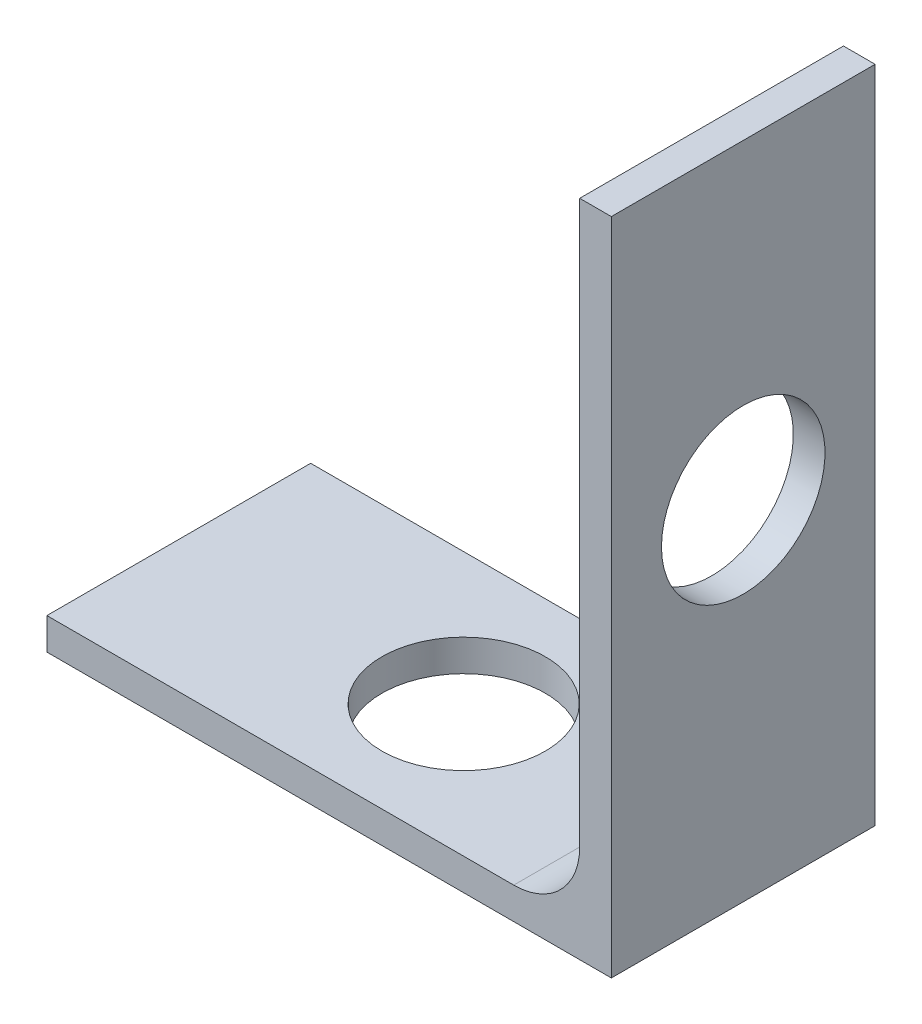
ISO-10303-21;
HEADER;
FILE_DESCRIPTION(('STEP AP214'),'2;1');
FILE_NAME('part.step','',(''),(''),'','','');
FILE_SCHEMA(('AUTOMOTIVE_DESIGN { 1 0 10303 214 1 1 1 1 }'));
ENDSEC;
DATA;
#1=APPLICATION_CONTEXT('core data for automotive mechanical design processes');
#2=APPLICATION_PROTOCOL_DEFINITION('international standard','automotive_design',2000,#1);
#3=PRODUCT_CONTEXT('',#1,'mechanical');
#4=PRODUCT('Part','Part','',(#3));
#5=PRODUCT_RELATED_PRODUCT_CATEGORY('part','',(#4));
#6=PRODUCT_DEFINITION_FORMATION('','',#4);
#7=PRODUCT_DEFINITION_CONTEXT('part definition',#1,'design');
#8=PRODUCT_DEFINITION('design','',#6,#7);
#9=PRODUCT_DEFINITION_SHAPE('','',#8);
#10=(LENGTH_UNIT() NAMED_UNIT(*) SI_UNIT(.MILLI.,.METRE.));
#11=(NAMED_UNIT(*) PLANE_ANGLE_UNIT() SI_UNIT($,.RADIAN.));
#12=(NAMED_UNIT(*) SI_UNIT($,.STERADIAN.) SOLID_ANGLE_UNIT());
#13=UNCERTAINTY_MEASURE_WITH_UNIT(LENGTH_MEASURE(1.E-05),#10,'distance_accuracy_value','');
#14=(GEOMETRIC_REPRESENTATION_CONTEXT(3) GLOBAL_UNCERTAINTY_ASSIGNED_CONTEXT((#13)) GLOBAL_UNIT_ASSIGNED_CONTEXT((#10,
#11,#12)) REPRESENTATION_CONTEXT('',''));
#15=CARTESIAN_POINT('',(0.,0.,0.));
#16=DIRECTION('',(0.,0.,1.));
#17=DIRECTION('',(1.,0.,0.));
#18=AXIS2_PLACEMENT_3D('',#15,#16,#17);
#19=CARTESIAN_POINT('',(22.479,4.699,12.7));
#20=DIRECTION('',(0.,0.,-1.));
#21=DIRECTION('',(-1.,0.,0.));
#22=AXIS2_PLACEMENT_3D('',#19,#20,#21);
#23=CYLINDRICAL_SURFACE('',#22,3.175);
#24=DIRECTION('',(0.,0.,1.));
#25=VECTOR('',#24,1.);
#26=CARTESIAN_POINT('',(25.654,4.699,12.7));
#27=LINE('',#26,#25);
#28=CARTESIAN_POINT('',(25.654,4.699,0.));
#29=VERTEX_POINT('',#28);
#30=CARTESIAN_POINT('',(25.654,4.699,12.7));
#31=VERTEX_POINT('',#30);
#32=EDGE_CURVE('E128',#29,#31,#27,.T.);
#33=ORIENTED_EDGE('',*,*,#32,.F.);
#34=CARTESIAN_POINT('',(22.479,4.699,0.));
#35=DIRECTION('',(0.,0.,-1.));
#36=DIRECTION('',(-1.,0.,0.));
#37=AXIS2_PLACEMENT_3D('',#34,#35,#36);
#38=CIRCLE('',#37,3.175);
#39=CARTESIAN_POINT('',(22.479,1.524,0.));
#40=VERTEX_POINT('',#39);
#41=EDGE_CURVE('E53',#29,#40,#38,.T.);
#42=ORIENTED_EDGE('',*,*,#41,.T.);
#43=DIRECTION('',(0.,0.,1.));
#44=VECTOR('',#43,1.);
#45=CARTESIAN_POINT('',(22.479,1.524,12.7));
#46=LINE('',#45,#44);
#47=CARTESIAN_POINT('',(22.479,1.524,12.7));
#48=VERTEX_POINT('',#47);
#49=EDGE_CURVE('E133',#48,#40,#46,.F.);
#50=ORIENTED_EDGE('',*,*,#49,.F.);
#51=CARTESIAN_POINT('',(22.479,4.699,12.7));
#52=DIRECTION('',(0.,0.,-1.));
#53=DIRECTION('',(-1.,0.,0.));
#54=AXIS2_PLACEMENT_3D('',#51,#52,#53);
#55=CIRCLE('',#54,3.175);
#56=EDGE_CURVE('E11',#48,#31,#55,.F.);
#57=ORIENTED_EDGE('',*,*,#56,.T.);
#58=EDGE_LOOP('',(#33,#42,#50,#57));
#59=FACE_BOUND('',#58,.T.);
#60=ADVANCED_FACE('F45',(#59),#23,.F.);
#61=CARTESIAN_POINT('',(0.,0.,12.7));
#62=DIRECTION('',(1.,0.,0.));
#63=DIRECTION('',(0.,0.,-1.));
#64=AXIS2_PLACEMENT_3D('',#61,#62,#63);
#65=PLANE('',#64);
#66=DIRECTION('',(0.,-1.,0.));
#67=VECTOR('',#66,1.);
#68=CARTESIAN_POINT('',(0.,0.,0.));
#69=LINE('',#68,#67);
#70=CARTESIAN_POINT('',(0.,1.524,0.));
#71=VERTEX_POINT('',#70);
#72=CARTESIAN_POINT('',(0.,0.,0.));
#73=VERTEX_POINT('',#72);
#74=EDGE_CURVE('E126',#71,#73,#69,.T.);
#75=ORIENTED_EDGE('',*,*,#74,.T.);
#76=DIRECTION('',(0.,0.,-1.));
#77=VECTOR('',#76,1.);
#78=CARTESIAN_POINT('',(0.,0.,12.7));
#79=LINE('',#78,#77);
#80=CARTESIAN_POINT('',(0.,0.,12.7));
#81=VERTEX_POINT('',#80);
#82=EDGE_CURVE('E105',#81,#73,#79,.T.);
#83=ORIENTED_EDGE('',*,*,#82,.F.);
#84=DIRECTION('',(0.,-1.,0.));
#85=VECTOR('',#84,1.);
#86=CARTESIAN_POINT('',(0.,0.,12.7));
#87=LINE('',#86,#85);
#88=CARTESIAN_POINT('',(0.,1.524,12.7));
#89=VERTEX_POINT('',#88);
#90=EDGE_CURVE('E112',#89,#81,#87,.T.);
#91=ORIENTED_EDGE('',*,*,#90,.F.);
#92=DIRECTION('',(0.,0.,-1.));
#93=VECTOR('',#92,1.);
#94=CARTESIAN_POINT('',(0.,1.524,12.7));
#95=LINE('',#94,#93);
#96=EDGE_CURVE('E156',#89,#71,#95,.T.);
#97=ORIENTED_EDGE('',*,*,#96,.T.);
#98=EDGE_LOOP('',(#75,#83,#91,#97));
#99=FACE_BOUND('',#98,.T.);
#100=ADVANCED_FACE('F124',(#99),#65,.F.);
#101=CARTESIAN_POINT('',(0.,0.,12.7));
#102=DIRECTION('',(0.,1.,0.));
#103=DIRECTION('',(0.,0.,1.));
#104=AXIS2_PLACEMENT_3D('',#101,#102,#103);
#105=PLANE('',#104);
#106=CARTESIAN_POINT('',(13.716,0.,6.35));
#107=DIRECTION('',(0.,1.,0.));
#108=DIRECTION('',(0.,0.,1.));
#109=AXIS2_PLACEMENT_3D('',#106,#107,#108);
#110=CIRCLE('',#109,3.93700000000001);
#111=CARTESIAN_POINT('',(13.716,0.,10.287));
#112=VERTEX_POINT('',#111);
#113=EDGE_CURVE('E200',#112,#112,#110,.T.);
#114=ORIENTED_EDGE('',*,*,#113,.T.);
#115=EDGE_LOOP('',(#114));
#116=FACE_BOUND('',#115,.T.);
#117=DIRECTION('',(1.,0.,0.));
#118=VECTOR('',#117,1.);
#119=CARTESIAN_POINT('',(0.,0.,0.));
#120=LINE('',#119,#118);
#121=CARTESIAN_POINT('',(27.178,0.,0.));
#122=VERTEX_POINT('',#121);
#123=EDGE_CURVE('E176',#73,#122,#120,.T.);
#124=ORIENTED_EDGE('',*,*,#123,.T.);
#125=DIRECTION('',(0.,0.,-1.));
#126=VECTOR('',#125,1.);
#127=CARTESIAN_POINT('',(27.178,0.,12.7));
#128=LINE('',#127,#126);
#129=CARTESIAN_POINT('',(27.178,0.,12.7));
#130=VERTEX_POINT('',#129);
#131=EDGE_CURVE('E108',#130,#122,#128,.T.);
#132=ORIENTED_EDGE('',*,*,#131,.F.);
#133=DIRECTION('',(1.,0.,0.));
#134=VECTOR('',#133,1.);
#135=CARTESIAN_POINT('',(0.,0.,12.7));
#136=LINE('',#135,#134);
#137=EDGE_CURVE('E101',#81,#130,#136,.T.);
#138=ORIENTED_EDGE('',*,*,#137,.F.);
#139=ORIENTED_EDGE('',*,*,#82,.T.);
#140=EDGE_LOOP('',(#124,#132,#138,#139));
#141=FACE_BOUND('',#140,.T.);
#142=ADVANCED_FACE('F103',(#116,#141),#105,.F.);
#143=CARTESIAN_POINT('',(27.178,0.,12.7));
#144=DIRECTION('',(-1.,0.,0.));
#145=DIRECTION('',(0.,0.,1.));
#146=AXIS2_PLACEMENT_3D('',#143,#144,#145);
#147=PLANE('',#146);
#148=CARTESIAN_POINT('',(27.178,16.764,6.35));
#149=DIRECTION('',(-1.,0.,0.));
#150=DIRECTION('',(0.,0.,1.));
#151=AXIS2_PLACEMENT_3D('',#148,#149,#150);
#152=CIRCLE('',#151,3.937);
#153=CARTESIAN_POINT('',(27.178,16.764,10.287));
#154=VERTEX_POINT('',#153);
#155=EDGE_CURVE('E183',#154,#154,#152,.T.);
#156=ORIENTED_EDGE('',*,*,#155,.T.);
#157=EDGE_LOOP('',(#156));
#158=FACE_BOUND('',#157,.T.);
#159=DIRECTION('',(0.,1.,0.));
#160=VECTOR('',#159,1.);
#161=CARTESIAN_POINT('',(27.178,0.,0.));
#162=LINE('',#161,#160);
#163=CARTESIAN_POINT('',(27.178,31.75,0.));
#164=VERTEX_POINT('',#163);
#165=EDGE_CURVE('E173',#122,#164,#162,.T.);
#166=ORIENTED_EDGE('',*,*,#165,.T.);
#167=DIRECTION('',(0.,0.,-1.));
#168=VECTOR('',#167,1.);
#169=CARTESIAN_POINT('',(27.178,31.75,12.7));
#170=LINE('',#169,#168);
#171=CARTESIAN_POINT('',(27.178,31.75,12.7));
#172=VERTEX_POINT('',#171);
#173=EDGE_CURVE('E135',#172,#164,#170,.T.);
#174=ORIENTED_EDGE('',*,*,#173,.F.);
#175=DIRECTION('',(0.,1.,0.));
#176=VECTOR('',#175,1.);
#177=CARTESIAN_POINT('',(27.178,0.,12.7));
#178=LINE('',#177,#176);
#179=EDGE_CURVE('E111',#130,#172,#178,.T.);
#180=ORIENTED_EDGE('',*,*,#179,.F.);
#181=ORIENTED_EDGE('',*,*,#131,.T.);
#182=EDGE_LOOP('',(#166,#174,#180,#181));
#183=FACE_BOUND('',#182,.T.);
#184=ADVANCED_FACE('F230',(#158,#183),#147,.F.);
#185=CARTESIAN_POINT('',(25.654,31.75,12.7));
#186=DIRECTION('',(0.,-1.,0.));
#187=DIRECTION('',(0.,0.,-1.));
#188=AXIS2_PLACEMENT_3D('',#185,#186,#187);
#189=PLANE('',#188);
#190=DIRECTION('',(-1.,0.,0.));
#191=VECTOR('',#190,1.);
#192=CARTESIAN_POINT('',(25.654,31.75,0.));
#193=LINE('',#192,#191);
#194=CARTESIAN_POINT('',(25.654,31.75,0.));
#195=VERTEX_POINT('',#194);
#196=EDGE_CURVE('E152',#164,#195,#193,.T.);
#197=ORIENTED_EDGE('',*,*,#196,.T.);
#198=DIRECTION('',(0.,0.,-1.));
#199=VECTOR('',#198,1.);
#200=CARTESIAN_POINT('',(25.654,31.75,12.7));
#201=LINE('',#200,#199);
#202=CARTESIAN_POINT('',(25.654,31.75,12.7));
#203=VERTEX_POINT('',#202);
#204=EDGE_CURVE('E159',#203,#195,#201,.T.);
#205=ORIENTED_EDGE('',*,*,#204,.F.);
#206=DIRECTION('',(-1.,0.,0.));
#207=VECTOR('',#206,1.);
#208=CARTESIAN_POINT('',(25.654,31.75,12.7));
#209=LINE('',#208,#207);
#210=EDGE_CURVE('E170',#172,#203,#209,.T.);
#211=ORIENTED_EDGE('',*,*,#210,.F.);
#212=ORIENTED_EDGE('',*,*,#173,.T.);
#213=EDGE_LOOP('',(#197,#205,#211,#212));
#214=FACE_BOUND('',#213,.T.);
#215=ADVANCED_FACE('F168',(#214),#189,.F.);
#216=CARTESIAN_POINT('',(25.654,1.524,12.7));
#217=DIRECTION('',(1.,0.,0.));
#218=DIRECTION('',(0.,0.,-1.));
#219=AXIS2_PLACEMENT_3D('',#216,#217,#218);
#220=PLANE('',#219);
#221=CARTESIAN_POINT('',(25.654,16.764,6.35));
#222=DIRECTION('',(-1.,0.,0.));
#223=DIRECTION('',(0.,0.,1.));
#224=AXIS2_PLACEMENT_3D('',#221,#222,#223);
#225=CIRCLE('',#224,3.937);
#226=CARTESIAN_POINT('',(25.654,16.764,10.287));
#227=VERTEX_POINT('',#226);
#228=EDGE_CURVE('E196',#227,#227,#225,.T.);
#229=ORIENTED_EDGE('',*,*,#228,.F.);
#230=EDGE_LOOP('',(#229));
#231=FACE_BOUND('',#230,.T.);
#232=DIRECTION('',(0.,-1.,0.));
#233=VECTOR('',#232,1.);
#234=CARTESIAN_POINT('',(25.654,1.524,0.));
#235=LINE('',#234,#233);
#236=EDGE_CURVE('E148',#195,#29,#235,.T.);
#237=ORIENTED_EDGE('',*,*,#236,.T.);
#238=ORIENTED_EDGE('',*,*,#32,.T.);
#239=DIRECTION('',(0.,-1.,0.));
#240=VECTOR('',#239,1.);
#241=CARTESIAN_POINT('',(25.654,1.524,12.7));
#242=LINE('',#241,#240);
#243=EDGE_CURVE('E186',#203,#31,#242,.T.);
#244=ORIENTED_EDGE('',*,*,#243,.F.);
#245=ORIENTED_EDGE('',*,*,#204,.T.);
#246=EDGE_LOOP('',(#237,#238,#244,#245));
#247=FACE_BOUND('',#246,.T.);
#248=ADVANCED_FACE('F213',(#231,#247),#220,.F.);
#249=CARTESIAN_POINT('',(0.,1.524,12.7));
#250=DIRECTION('',(0.,-1.,0.));
#251=DIRECTION('',(0.,0.,-1.));
#252=AXIS2_PLACEMENT_3D('',#249,#250,#251);
#253=PLANE('',#252);
#254=CARTESIAN_POINT('',(13.716,1.524,6.35));
#255=DIRECTION('',(0.,1.,0.));
#256=DIRECTION('',(0.,0.,1.));
#257=AXIS2_PLACEMENT_3D('',#254,#255,#256);
#258=CIRCLE('',#257,3.93700000000001);
#259=CARTESIAN_POINT('',(13.716,1.524,10.287));
#260=VERTEX_POINT('',#259);
#261=EDGE_CURVE('E204',#260,#260,#258,.T.);
#262=ORIENTED_EDGE('',*,*,#261,.F.);
#263=EDGE_LOOP('',(#262));
#264=FACE_BOUND('',#263,.T.);
#265=DIRECTION('',(-1.,0.,0.));
#266=VECTOR('',#265,1.);
#267=CARTESIAN_POINT('',(0.,1.524,12.7));
#268=LINE('',#267,#266);
#269=EDGE_CURVE('E117',#48,#89,#268,.T.);
#270=ORIENTED_EDGE('',*,*,#269,.F.);
#271=ORIENTED_EDGE('',*,*,#49,.T.);
#272=DIRECTION('',(-1.,0.,0.));
#273=VECTOR('',#272,1.);
#274=CARTESIAN_POINT('',(0.,1.524,0.));
#275=LINE('',#274,#273);
#276=EDGE_CURVE('E122',#40,#71,#275,.T.);
#277=ORIENTED_EDGE('',*,*,#276,.T.);
#278=ORIENTED_EDGE('',*,*,#96,.F.);
#279=EDGE_LOOP('',(#270,#271,#277,#278));
#280=FACE_BOUND('',#279,.T.);
#281=ADVANCED_FACE('F143',(#264,#280),#253,.F.);
#282=CARTESIAN_POINT('',(0.,0.,12.7));
#283=DIRECTION('',(0.,0.,-1.));
#284=DIRECTION('',(-1.,0.,0.));
#285=AXIS2_PLACEMENT_3D('',#282,#283,#284);
#286=PLANE('',#285);
#287=ORIENTED_EDGE('',*,*,#56,.F.);
#288=ORIENTED_EDGE('',*,*,#269,.T.);
#289=ORIENTED_EDGE('',*,*,#90,.T.);
#290=ORIENTED_EDGE('',*,*,#137,.T.);
#291=ORIENTED_EDGE('',*,*,#179,.T.);
#292=ORIENTED_EDGE('',*,*,#210,.T.);
#293=ORIENTED_EDGE('',*,*,#243,.T.);
#294=EDGE_LOOP('',(#287,#288,#289,#290,#291,#292,#293));
#295=FACE_BOUND('',#294,.T.);
#296=ADVANCED_FACE('F115',(#295),#286,.F.);
#297=CARTESIAN_POINT('',(0.,0.,0.));
#298=DIRECTION('',(0.,0.,-1.));
#299=DIRECTION('',(-1.,0.,0.));
#300=AXIS2_PLACEMENT_3D('',#297,#298,#299);
#301=PLANE('',#300);
#302=ORIENTED_EDGE('',*,*,#74,.F.);
#303=ORIENTED_EDGE('',*,*,#276,.F.);
#304=ORIENTED_EDGE('',*,*,#41,.F.);
#305=ORIENTED_EDGE('',*,*,#236,.F.);
#306=ORIENTED_EDGE('',*,*,#196,.F.);
#307=ORIENTED_EDGE('',*,*,#165,.F.);
#308=ORIENTED_EDGE('',*,*,#123,.F.);
#309=EDGE_LOOP('',(#302,#303,#304,#305,#306,#307,#308));
#310=FACE_BOUND('',#309,.T.);
#311=ADVANCED_FACE('F145',(#310),#301,.T.);
#312=CARTESIAN_POINT('',(32.004,16.764,6.35));
#313=DIRECTION('',(-1.,0.,0.));
#314=DIRECTION('',(0.,0.,1.));
#315=AXIS2_PLACEMENT_3D('',#312,#313,#314);
#316=CYLINDRICAL_SURFACE('',#315,3.937);
#317=ORIENTED_EDGE('',*,*,#228,.T.);
#318=EDGE_LOOP('',(#317));
#319=FACE_BOUND('',#318,.T.);
#320=ORIENTED_EDGE('',*,*,#155,.F.);
#321=EDGE_LOOP('',(#320));
#322=FACE_BOUND('',#321,.T.);
#323=ADVANCED_FACE('F244',(#319,#322),#316,.F.);
#324=CARTESIAN_POINT('',(13.716,-4.826,6.35));
#325=DIRECTION('',(0.,1.,0.));
#326=DIRECTION('',(0.,0.,1.));
#327=AXIS2_PLACEMENT_3D('',#324,#325,#326);
#328=CYLINDRICAL_SURFACE('',#327,3.93700000000001);
#329=ORIENTED_EDGE('',*,*,#261,.T.);
#330=EDGE_LOOP('',(#329));
#331=FACE_BOUND('',#330,.T.);
#332=ORIENTED_EDGE('',*,*,#113,.F.);
#333=EDGE_LOOP('',(#332));
#334=FACE_BOUND('',#333,.T.);
#335=ADVANCED_FACE('F209',(#331,#334),#328,.F.);
#336=CLOSED_SHELL('',(#60,#100,#142,#184,#215,#248,#281,#296,#311,#323,#335));
#337=MANIFOLD_SOLID_BREP('B2',#336);
#338=ADVANCED_BREP_SHAPE_REPRESENTATION('',(#18,#337),#14);
#339=SHAPE_DEFINITION_REPRESENTATION(#9,#338);
ENDSEC;
END-ISO-10303-21;
